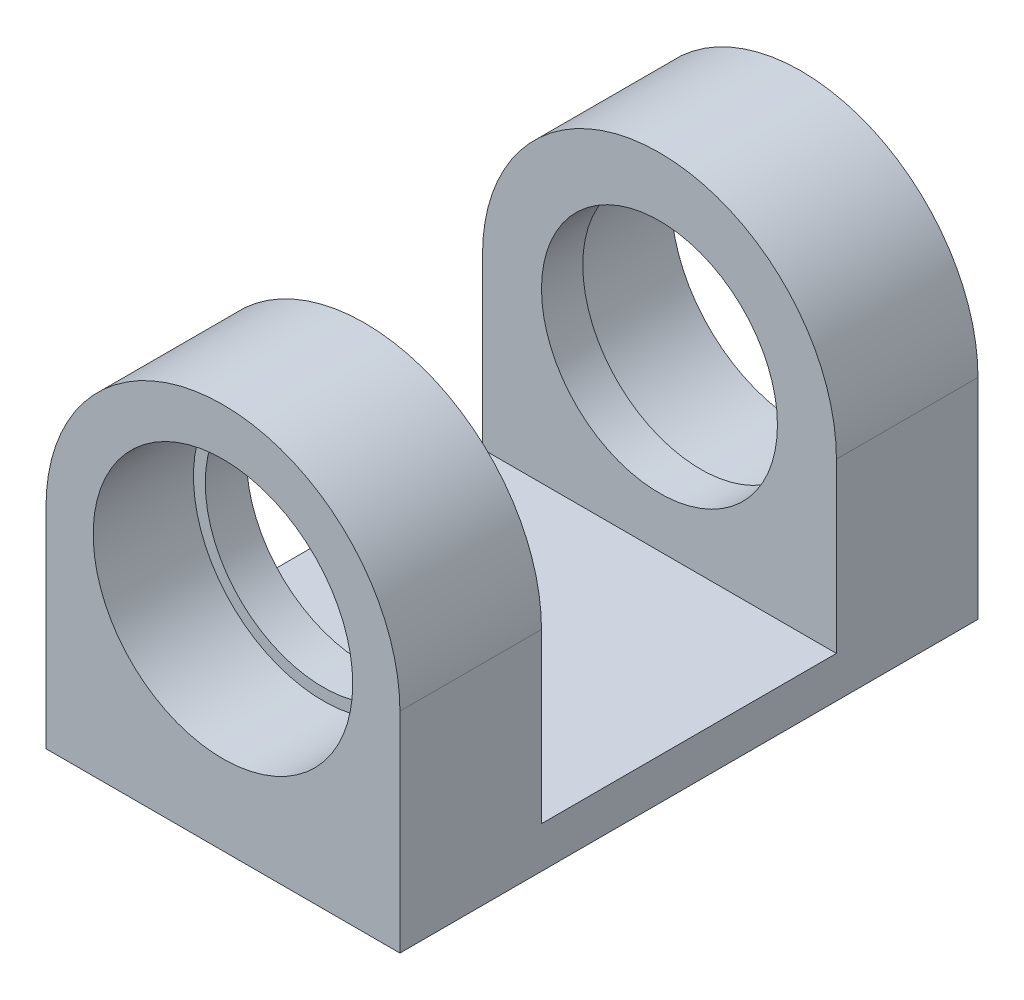
ISO-10303-21;
HEADER;
FILE_DESCRIPTION(('STEP AP214'),'2;1');
FILE_NAME('part.step','',(''),(''),'','','');
FILE_SCHEMA(('AUTOMOTIVE_DESIGN { 1 0 10303 214 1 1 1 1 }'));
ENDSEC;
DATA;
#1=APPLICATION_CONTEXT('core data for automotive mechanical design processes');
#2=APPLICATION_PROTOCOL_DEFINITION('international standard','automotive_design',2000,#1);
#3=PRODUCT_CONTEXT('',#1,'mechanical');
#4=PRODUCT('Part','Part','',(#3));
#5=PRODUCT_RELATED_PRODUCT_CATEGORY('part','',(#4));
#6=PRODUCT_DEFINITION_FORMATION('','',#4);
#7=PRODUCT_DEFINITION_CONTEXT('part definition',#1,'design');
#8=PRODUCT_DEFINITION('design','',#6,#7);
#9=PRODUCT_DEFINITION_SHAPE('','',#8);
#10=(LENGTH_UNIT() NAMED_UNIT(*) SI_UNIT(.MILLI.,.METRE.));
#11=(NAMED_UNIT(*) PLANE_ANGLE_UNIT() SI_UNIT($,.RADIAN.));
#12=(NAMED_UNIT(*) SI_UNIT($,.STERADIAN.) SOLID_ANGLE_UNIT());
#13=UNCERTAINTY_MEASURE_WITH_UNIT(LENGTH_MEASURE(1.E-05),#10,'distance_accuracy_value','');
#14=(GEOMETRIC_REPRESENTATION_CONTEXT(3) GLOBAL_UNCERTAINTY_ASSIGNED_CONTEXT((#13)) GLOBAL_UNIT_ASSIGNED_CONTEXT((#10,
#11,#12)) REPRESENTATION_CONTEXT('',''));
#15=CARTESIAN_POINT('',(0.,0.,0.));
#16=DIRECTION('',(0.,0.,1.));
#17=DIRECTION('',(1.,0.,0.));
#18=AXIS2_PLACEMENT_3D('',#15,#16,#17);
#19=CARTESIAN_POINT('',(-15.,17.76,-6.));
#20=DIRECTION('',(0.,0.,1.));
#21=DIRECTION('',(1.,0.,0.));
#22=AXIS2_PLACEMENT_3D('',#19,#20,#21);
#23=PLANE('',#22);
#24=CARTESIAN_POINT('',(-15.,17.76,-6.));
#25=DIRECTION('',(0.,0.,1.));
#26=DIRECTION('',(1.,0.,0.));
#27=AXIS2_PLACEMENT_3D('',#24,#25,#26);
#28=CIRCLE('',#27,10.);
#29=CARTESIAN_POINT('',(-5.,17.76,-6.));
#30=VERTEX_POINT('',#29);
#31=EDGE_CURVE('E188',#30,#30,#28,.T.);
#32=ORIENTED_EDGE('',*,*,#31,.T.);
#33=EDGE_LOOP('',(#32));
#34=FACE_BOUND('',#33,.T.);
#35=DIRECTION('',(1.,0.,0.));
#36=VECTOR('',#35,1.);
#37=CARTESIAN_POINT('',(0.,3.5,-6.));
#38=LINE('',#37,#36);
#39=CARTESIAN_POINT('',(-30.,3.5,-6.));
#40=VERTEX_POINT('',#39);
#41=CARTESIAN_POINT('',(0.,3.5,-6.));
#42=VERTEX_POINT('',#41);
#43=EDGE_CURVE('E62',#40,#42,#38,.T.);
#44=ORIENTED_EDGE('',*,*,#43,.F.);
#45=DIRECTION('',(0.,-1.,0.));
#46=VECTOR('',#45,1.);
#47=CARTESIAN_POINT('',(-30.,0.,-6.));
#48=LINE('',#47,#46);
#49=CARTESIAN_POINT('',(-30.,17.76,-6.));
#50=VERTEX_POINT('',#49);
#51=EDGE_CURVE('E204',#50,#40,#48,.T.);
#52=ORIENTED_EDGE('',*,*,#51,.F.);
#53=CARTESIAN_POINT('',(-15.,17.76,-6.));
#54=DIRECTION('',(0.,0.,1.));
#55=DIRECTION('',(1.,0.,0.));
#56=AXIS2_PLACEMENT_3D('',#53,#54,#55);
#57=CIRCLE('',#56,15.);
#58=CARTESIAN_POINT('',(0.,17.76,-6.));
#59=VERTEX_POINT('',#58);
#60=EDGE_CURVE('E88',#59,#50,#57,.T.);
#61=ORIENTED_EDGE('',*,*,#60,.F.);
#62=DIRECTION('',(0.,1.,0.));
#63=VECTOR('',#62,1.);
#64=CARTESIAN_POINT('',(0.,0.,-6.));
#65=LINE('',#64,#63);
#66=EDGE_CURVE('E196',#42,#59,#65,.T.);
#67=ORIENTED_EDGE('',*,*,#66,.F.);
#68=EDGE_LOOP('',(#44,#52,#61,#67));
#69=FACE_BOUND('',#68,.T.);
#70=ADVANCED_FACE('F44',(#34,#69),#23,.F.);
#71=CARTESIAN_POINT('',(0.,0.,6.));
#72=DIRECTION('',(-1.,0.,0.));
#73=DIRECTION('',(0.,0.,1.));
#74=AXIS2_PLACEMENT_3D('',#71,#72,#73);
#75=PLANE('',#74);
#76=DIRECTION('',(0.,0.,-1.));
#77=VECTOR('',#76,1.);
#78=CARTESIAN_POINT('',(0.,0.,6.));
#79=LINE('',#78,#77);
#80=CARTESIAN_POINT('',(0.,0.,6.));
#81=VERTEX_POINT('',#80);
#82=CARTESIAN_POINT('',(0.,0.,-43.));
#83=VERTEX_POINT('',#82);
#84=EDGE_CURVE('E120',#81,#83,#79,.T.);
#85=ORIENTED_EDGE('',*,*,#84,.T.);
#86=DIRECTION('',(0.,1.,0.));
#87=VECTOR('',#86,1.);
#88=CARTESIAN_POINT('',(0.,0.,-43.));
#89=LINE('',#88,#87);
#90=CARTESIAN_POINT('',(0.,17.76,-43.));
#91=VERTEX_POINT('',#90);
#92=EDGE_CURVE('E123',#83,#91,#89,.T.);
#93=ORIENTED_EDGE('',*,*,#92,.T.);
#94=DIRECTION('',(0.,0.,1.));
#95=VECTOR('',#94,1.);
#96=CARTESIAN_POINT('',(0.,17.76,-43.));
#97=LINE('',#96,#95);
#98=CARTESIAN_POINT('',(0.,17.76,-31.));
#99=VERTEX_POINT('',#98);
#100=EDGE_CURVE('E152',#91,#99,#97,.T.);
#101=ORIENTED_EDGE('',*,*,#100,.T.);
#102=DIRECTION('',(0.,1.,0.));
#103=VECTOR('',#102,1.);
#104=CARTESIAN_POINT('',(0.,0.,-31.));
#105=LINE('',#104,#103);
#106=CARTESIAN_POINT('',(0.,3.5,-31.));
#107=VERTEX_POINT('',#106);
#108=EDGE_CURVE('E154',#107,#99,#105,.T.);
#109=ORIENTED_EDGE('',*,*,#108,.F.);
#110=DIRECTION('',(0.,0.,1.));
#111=VECTOR('',#110,1.);
#112=CARTESIAN_POINT('',(0.,3.5,-31.));
#113=LINE('',#112,#111);
#114=EDGE_CURVE('E175',#107,#42,#113,.T.);
#115=ORIENTED_EDGE('',*,*,#114,.T.);
#116=ORIENTED_EDGE('',*,*,#66,.T.);
#117=DIRECTION('',(0.,0.,-1.));
#118=VECTOR('',#117,1.);
#119=CARTESIAN_POINT('',(0.,17.76,6.));
#120=LINE('',#119,#118);
#121=CARTESIAN_POINT('',(0.,17.76,6.));
#122=VERTEX_POINT('',#121);
#123=EDGE_CURVE('E11',#122,#59,#120,.T.);
#124=ORIENTED_EDGE('',*,*,#123,.F.);
#125=DIRECTION('',(0.,1.,0.));
#126=VECTOR('',#125,1.);
#127=CARTESIAN_POINT('',(0.,0.,6.));
#128=LINE('',#127,#126);
#129=EDGE_CURVE('E127',#81,#122,#128,.T.);
#130=ORIENTED_EDGE('',*,*,#129,.F.);
#131=EDGE_LOOP('',(#85,#93,#101,#109,#115,#116,#124,#130));
#132=FACE_BOUND('',#131,.T.);
#133=ADVANCED_FACE('F50',(#132),#75,.F.);
#134=CARTESIAN_POINT('',(-15.,17.76,6.));
#135=DIRECTION('',(0.,0.,-1.));
#136=DIRECTION('',(-1.,0.,0.));
#137=AXIS2_PLACEMENT_3D('',#134,#135,#136);
#138=CYLINDRICAL_SURFACE('',#137,15.);
#139=ORIENTED_EDGE('',*,*,#60,.T.);
#140=DIRECTION('',(0.,0.,-1.));
#141=VECTOR('',#140,1.);
#142=CARTESIAN_POINT('',(-30.,17.76,6.));
#143=LINE('',#142,#141);
#144=CARTESIAN_POINT('',(-30.,17.76,6.));
#145=VERTEX_POINT('',#144);
#146=EDGE_CURVE('E54',#145,#50,#143,.T.);
#147=ORIENTED_EDGE('',*,*,#146,.F.);
#148=CARTESIAN_POINT('',(-15.,17.76,6.));
#149=DIRECTION('',(0.,0.,1.));
#150=DIRECTION('',(1.,0.,0.));
#151=AXIS2_PLACEMENT_3D('',#148,#149,#150);
#152=CIRCLE('',#151,15.);
#153=EDGE_CURVE('E93',#122,#145,#152,.T.);
#154=ORIENTED_EDGE('',*,*,#153,.F.);
#155=ORIENTED_EDGE('',*,*,#123,.T.);
#156=EDGE_LOOP('',(#139,#147,#154,#155));
#157=FACE_BOUND('',#156,.T.);
#158=ADVANCED_FACE('F221',(#157),#138,.T.);
#159=CARTESIAN_POINT('',(-30.,0.,6.));
#160=DIRECTION('',(1.,0.,0.));
#161=DIRECTION('',(0.,0.,-1.));
#162=AXIS2_PLACEMENT_3D('',#159,#160,#161);
#163=PLANE('',#162);
#164=ORIENTED_EDGE('',*,*,#51,.T.);
#165=DIRECTION('',(0.,0.,1.));
#166=VECTOR('',#165,1.);
#167=CARTESIAN_POINT('',(-30.,3.5,-31.));
#168=LINE('',#167,#166);
#169=CARTESIAN_POINT('',(-30.,3.5,-31.));
#170=VERTEX_POINT('',#169);
#171=EDGE_CURVE('E182',#170,#40,#168,.T.);
#172=ORIENTED_EDGE('',*,*,#171,.F.);
#173=DIRECTION('',(0.,-1.,0.));
#174=VECTOR('',#173,1.);
#175=CARTESIAN_POINT('',(-30.,0.,-31.));
#176=LINE('',#175,#174);
#177=CARTESIAN_POINT('',(-30.,17.76,-31.));
#178=VERTEX_POINT('',#177);
#179=EDGE_CURVE('E158',#178,#170,#176,.T.);
#180=ORIENTED_EDGE('',*,*,#179,.F.);
#181=DIRECTION('',(0.,0.,1.));
#182=VECTOR('',#181,1.);
#183=CARTESIAN_POINT('',(-30.,17.76,-43.));
#184=LINE('',#183,#182);
#185=CARTESIAN_POINT('',(-30.,17.76,-43.));
#186=VERTEX_POINT('',#185);
#187=EDGE_CURVE('E169',#186,#178,#184,.T.);
#188=ORIENTED_EDGE('',*,*,#187,.F.);
#189=DIRECTION('',(0.,-1.,0.));
#190=VECTOR('',#189,1.);
#191=CARTESIAN_POINT('',(-30.,0.,-43.));
#192=LINE('',#191,#190);
#193=CARTESIAN_POINT('',(-30.,0.,-43.));
#194=VERTEX_POINT('',#193);
#195=EDGE_CURVE('E148',#186,#194,#192,.T.);
#196=ORIENTED_EDGE('',*,*,#195,.T.);
#197=DIRECTION('',(0.,0.,-1.));
#198=VECTOR('',#197,1.);
#199=CARTESIAN_POINT('',(-30.,0.,6.));
#200=LINE('',#199,#198);
#201=CARTESIAN_POINT('',(-30.,0.,6.));
#202=VERTEX_POINT('',#201);
#203=EDGE_CURVE('E128',#202,#194,#200,.T.);
#204=ORIENTED_EDGE('',*,*,#203,.F.);
#205=DIRECTION('',(0.,-1.,0.));
#206=VECTOR('',#205,1.);
#207=CARTESIAN_POINT('',(-30.,0.,6.));
#208=LINE('',#207,#206);
#209=EDGE_CURVE('E210',#145,#202,#208,.T.);
#210=ORIENTED_EDGE('',*,*,#209,.F.);
#211=ORIENTED_EDGE('',*,*,#146,.T.);
#212=EDGE_LOOP('',(#164,#172,#180,#188,#196,#204,#210,#211));
#213=FACE_BOUND('',#212,.T.);
#214=ADVANCED_FACE('F224',(#213),#163,.F.);
#215=CARTESIAN_POINT('',(0.,0.,6.));
#216=DIRECTION('',(0.,1.,0.));
#217=DIRECTION('',(0.,0.,1.));
#218=AXIS2_PLACEMENT_3D('',#215,#216,#217);
#219=PLANE('',#218);
#220=ORIENTED_EDGE('',*,*,#203,.T.);
#221=DIRECTION('',(1.,0.,0.));
#222=VECTOR('',#221,1.);
#223=CARTESIAN_POINT('',(0.,0.,-43.));
#224=LINE('',#223,#222);
#225=EDGE_CURVE('E137',#194,#83,#224,.T.);
#226=ORIENTED_EDGE('',*,*,#225,.T.);
#227=ORIENTED_EDGE('',*,*,#84,.F.);
#228=DIRECTION('',(1.,0.,0.));
#229=VECTOR('',#228,1.);
#230=CARTESIAN_POINT('',(0.,0.,6.));
#231=LINE('',#230,#229);
#232=EDGE_CURVE('E72',#202,#81,#231,.T.);
#233=ORIENTED_EDGE('',*,*,#232,.F.);
#234=EDGE_LOOP('',(#220,#226,#227,#233));
#235=FACE_BOUND('',#234,.T.);
#236=ADVANCED_FACE('F141',(#235),#219,.F.);
#237=CARTESIAN_POINT('',(-15.,17.76,6.));
#238=DIRECTION('',(0.,0.,1.));
#239=DIRECTION('',(1.,0.,0.));
#240=AXIS2_PLACEMENT_3D('',#237,#238,#239);
#241=PLANE('',#240);
#242=CARTESIAN_POINT('',(-15.,17.76,6.));
#243=DIRECTION('',(0.,0.,1.));
#244=DIRECTION('',(1.,0.,0.));
#245=AXIS2_PLACEMENT_3D('',#242,#243,#244);
#246=CIRCLE('',#245,11.);
#247=CARTESIAN_POINT('',(-4.,17.76,6.));
#248=VERTEX_POINT('',#247);
#249=EDGE_CURVE('E193',#248,#248,#246,.T.);
#250=ORIENTED_EDGE('',*,*,#249,.F.);
#251=EDGE_LOOP('',(#250));
#252=FACE_BOUND('',#251,.T.);
#253=ORIENTED_EDGE('',*,*,#129,.T.);
#254=ORIENTED_EDGE('',*,*,#153,.T.);
#255=ORIENTED_EDGE('',*,*,#209,.T.);
#256=ORIENTED_EDGE('',*,*,#232,.T.);
#257=EDGE_LOOP('',(#253,#254,#255,#256));
#258=FACE_BOUND('',#257,.T.);
#259=ADVANCED_FACE('F258',(#252,#258),#241,.T.);
#260=CARTESIAN_POINT('',(-15.,17.76,-2.5));
#261=DIRECTION('',(0.,0.,1.));
#262=DIRECTION('',(1.,0.,0.));
#263=AXIS2_PLACEMENT_3D('',#260,#261,#262);
#264=PLANE('',#263);
#265=CARTESIAN_POINT('',(-15.,17.76,-2.5));
#266=DIRECTION('',(0.,0.,1.));
#267=DIRECTION('',(1.,0.,0.));
#268=AXIS2_PLACEMENT_3D('',#265,#266,#267);
#269=CIRCLE('',#268,10.);
#270=CARTESIAN_POINT('',(-5.,17.76,-2.5));
#271=VERTEX_POINT('',#270);
#272=EDGE_CURVE('E183',#271,#271,#269,.T.);
#273=ORIENTED_EDGE('',*,*,#272,.F.);
#274=EDGE_LOOP('',(#273));
#275=FACE_BOUND('',#274,.T.);
#276=CARTESIAN_POINT('',(-15.,17.76,-2.5));
#277=DIRECTION('',(0.,0.,1.));
#278=DIRECTION('',(1.,0.,0.));
#279=AXIS2_PLACEMENT_3D('',#276,#277,#278);
#280=CIRCLE('',#279,11.);
#281=CARTESIAN_POINT('',(-4.,17.76,-2.5));
#282=VERTEX_POINT('',#281);
#283=EDGE_CURVE('E194',#282,#282,#280,.T.);
#284=ORIENTED_EDGE('',*,*,#283,.T.);
#285=EDGE_LOOP('',(#284));
#286=FACE_BOUND('',#285,.T.);
#287=ADVANCED_FACE('F272',(#275,#286),#264,.T.);
#288=CARTESIAN_POINT('',(-15.,17.76,-2.5));
#289=DIRECTION('',(0.,0.,1.));
#290=DIRECTION('',(1.,0.,0.));
#291=AXIS2_PLACEMENT_3D('',#288,#289,#290);
#292=CYLINDRICAL_SURFACE('',#291,11.);
#293=ORIENTED_EDGE('',*,*,#283,.F.);
#294=EDGE_LOOP('',(#293));
#295=FACE_BOUND('',#294,.T.);
#296=ORIENTED_EDGE('',*,*,#249,.T.);
#297=EDGE_LOOP('',(#296));
#298=FACE_BOUND('',#297,.T.);
#299=ADVANCED_FACE('F278',(#295,#298),#292,.F.);
#300=CARTESIAN_POINT('',(-15.,17.76,-11.));
#301=DIRECTION('',(0.,0.,1.));
#302=DIRECTION('',(1.,0.,0.));
#303=AXIS2_PLACEMENT_3D('',#300,#301,#302);
#304=CYLINDRICAL_SURFACE('',#303,10.);
#305=ORIENTED_EDGE('',*,*,#272,.T.);
#306=EDGE_LOOP('',(#305));
#307=FACE_BOUND('',#306,.T.);
#308=ORIENTED_EDGE('',*,*,#31,.F.);
#309=EDGE_LOOP('',(#308));
#310=FACE_BOUND('',#309,.T.);
#311=ADVANCED_FACE('F283',(#307,#310),#304,.F.);
#312=CARTESIAN_POINT('',(0.,3.5,-31.));
#313=DIRECTION('',(0.,-1.,0.));
#314=DIRECTION('',(1.,0.,0.));
#315=AXIS2_PLACEMENT_3D('',#312,#313,#314);
#316=PLANE('',#315);
#317=ORIENTED_EDGE('',*,*,#43,.T.);
#318=ORIENTED_EDGE('',*,*,#114,.F.);
#319=DIRECTION('',(1.,0.,0.));
#320=VECTOR('',#319,1.);
#321=CARTESIAN_POINT('',(0.,3.5,-31.));
#322=LINE('',#321,#320);
#323=EDGE_CURVE('E171',#170,#107,#322,.T.);
#324=ORIENTED_EDGE('',*,*,#323,.F.);
#325=ORIENTED_EDGE('',*,*,#171,.T.);
#326=EDGE_LOOP('',(#317,#318,#324,#325));
#327=FACE_BOUND('',#326,.T.);
#328=ADVANCED_FACE('F229',(#327),#316,.F.);
#329=CARTESIAN_POINT('',(-15.,17.76,-31.));
#330=DIRECTION('',(0.,0.,-1.));
#331=DIRECTION('',(1.,0.,0.));
#332=AXIS2_PLACEMENT_3D('',#329,#330,#331);
#333=PLANE('',#332);
#334=CARTESIAN_POINT('',(-15.,17.76,-31.));
#335=DIRECTION('',(0.,0.,-1.));
#336=DIRECTION('',(-1.,0.,0.));
#337=AXIS2_PLACEMENT_3D('',#334,#335,#336);
#338=CIRCLE('',#337,10.);
#339=CARTESIAN_POINT('',(-25.,17.76,-31.));
#340=VERTEX_POINT('',#339);
#341=EDGE_CURVE('E47',#340,#340,#338,.F.);
#342=ORIENTED_EDGE('',*,*,#341,.F.);
#343=EDGE_LOOP('',(#342));
#344=FACE_BOUND('',#343,.T.);
#345=ORIENTED_EDGE('',*,*,#179,.T.);
#346=ORIENTED_EDGE('',*,*,#323,.T.);
#347=ORIENTED_EDGE('',*,*,#108,.T.);
#348=CARTESIAN_POINT('',(-15.,17.76,-31.));
#349=DIRECTION('',(0.,0.,1.));
#350=DIRECTION('',(1.,0.,0.));
#351=AXIS2_PLACEMENT_3D('',#348,#349,#350);
#352=CIRCLE('',#351,15.);
#353=EDGE_CURVE('E143',#99,#178,#352,.T.);
#354=ORIENTED_EDGE('',*,*,#353,.T.);
#355=EDGE_LOOP('',(#345,#346,#347,#354));
#356=FACE_BOUND('',#355,.T.);
#357=ADVANCED_FACE('F230',(#344,#356),#333,.F.);
#358=CARTESIAN_POINT('',(-15.,17.76,-43.));
#359=DIRECTION('',(0.,0.,1.));
#360=DIRECTION('',(1.,0.,0.));
#361=AXIS2_PLACEMENT_3D('',#358,#359,#360);
#362=CYLINDRICAL_SURFACE('',#361,15.);
#363=ORIENTED_EDGE('',*,*,#353,.F.);
#364=ORIENTED_EDGE('',*,*,#100,.F.);
#365=CARTESIAN_POINT('',(-15.,17.76,-43.));
#366=DIRECTION('',(0.,0.,1.));
#367=DIRECTION('',(1.,0.,0.));
#368=AXIS2_PLACEMENT_3D('',#365,#366,#367);
#369=CIRCLE('',#368,15.);
#370=EDGE_CURVE('E139',#91,#186,#369,.T.);
#371=ORIENTED_EDGE('',*,*,#370,.T.);
#372=ORIENTED_EDGE('',*,*,#187,.T.);
#373=EDGE_LOOP('',(#363,#364,#371,#372));
#374=FACE_BOUND('',#373,.T.);
#375=ADVANCED_FACE('F234',(#374),#362,.T.);
#376=CARTESIAN_POINT('',(-15.,17.76,-43.));
#377=DIRECTION('',(0.,0.,-1.));
#378=DIRECTION('',(1.,0.,0.));
#379=AXIS2_PLACEMENT_3D('',#376,#377,#378);
#380=PLANE('',#379);
#381=CARTESIAN_POINT('',(-15.,17.76,-43.));
#382=DIRECTION('',(0.,0.,1.));
#383=DIRECTION('',(1.,0.,0.));
#384=AXIS2_PLACEMENT_3D('',#381,#382,#383);
#385=CIRCLE('',#384,11.);
#386=CARTESIAN_POINT('',(-4.,17.76,-43.));
#387=VERTEX_POINT('',#386);
#388=EDGE_CURVE('E393',#387,#387,#385,.T.);
#389=ORIENTED_EDGE('',*,*,#388,.T.);
#390=EDGE_LOOP('',(#389));
#391=FACE_BOUND('',#390,.T.);
#392=ORIENTED_EDGE('',*,*,#92,.F.);
#393=ORIENTED_EDGE('',*,*,#225,.F.);
#394=ORIENTED_EDGE('',*,*,#195,.F.);
#395=ORIENTED_EDGE('',*,*,#370,.F.);
#396=EDGE_LOOP('',(#392,#393,#394,#395));
#397=FACE_BOUND('',#396,.T.);
#398=ADVANCED_FACE('F133',(#391,#397),#380,.T.);
#399=CARTESIAN_POINT('',(-15.,17.76,-34.5));
#400=DIRECTION('',(0.,0.,-1.));
#401=DIRECTION('',(-1.,0.,0.));
#402=AXIS2_PLACEMENT_3D('',#399,#400,#401);
#403=CYLINDRICAL_SURFACE('',#402,11.);
#404=CARTESIAN_POINT('',(-15.,17.76,-34.5));
#405=DIRECTION('',(0.,0.,1.));
#406=DIRECTION('',(1.,0.,0.));
#407=AXIS2_PLACEMENT_3D('',#404,#405,#406);
#408=CIRCLE('',#407,11.);
#409=CARTESIAN_POINT('',(-4.,17.76,-34.5));
#410=VERTEX_POINT('',#409);
#411=EDGE_CURVE('E157',#410,#410,#408,.T.);
#412=ORIENTED_EDGE('',*,*,#411,.T.);
#413=EDGE_LOOP('',(#412));
#414=FACE_BOUND('',#413,.T.);
#415=ORIENTED_EDGE('',*,*,#388,.F.);
#416=EDGE_LOOP('',(#415));
#417=FACE_BOUND('',#416,.T.);
#418=ADVANCED_FACE('F241',(#414,#417),#403,.F.);
#419=CARTESIAN_POINT('',(-15.,17.76,-34.5));
#420=DIRECTION('',(0.,0.,-1.));
#421=DIRECTION('',(1.,0.,0.));
#422=AXIS2_PLACEMENT_3D('',#419,#420,#421);
#423=PLANE('',#422);
#424=CARTESIAN_POINT('',(-15.,17.76,-34.5));
#425=DIRECTION('',(0.,0.,1.));
#426=DIRECTION('',(1.,0.,0.));
#427=AXIS2_PLACEMENT_3D('',#424,#425,#426);
#428=CIRCLE('',#427,10.);
#429=CARTESIAN_POINT('',(-5.,17.76,-34.5));
#430=VERTEX_POINT('',#429);
#431=EDGE_CURVE('E388',#430,#430,#428,.T.);
#432=ORIENTED_EDGE('',*,*,#431,.T.);
#433=EDGE_LOOP('',(#432));
#434=FACE_BOUND('',#433,.T.);
#435=ORIENTED_EDGE('',*,*,#411,.F.);
#436=EDGE_LOOP('',(#435));
#437=FACE_BOUND('',#436,.T.);
#438=ADVANCED_FACE('F365',(#434,#437),#423,.T.);
#439=CARTESIAN_POINT('',(-15.,17.76,-26.));
#440=DIRECTION('',(0.,0.,-1.));
#441=DIRECTION('',(-1.,0.,0.));
#442=AXIS2_PLACEMENT_3D('',#439,#440,#441);
#443=CYLINDRICAL_SURFACE('',#442,10.);
#444=ORIENTED_EDGE('',*,*,#431,.F.);
#445=EDGE_LOOP('',(#444));
#446=FACE_BOUND('',#445,.T.);
#447=ORIENTED_EDGE('',*,*,#341,.T.);
#448=EDGE_LOOP('',(#447));
#449=FACE_BOUND('',#448,.T.);
#450=ADVANCED_FACE('F372',(#446,#449),#443,.F.);
#451=CLOSED_SHELL('',(#70,#133,#158,#214,#236,#259,#287,#299,#311,#328,#357,#375,#398,#418,#438,#450));
#452=MANIFOLD_SOLID_BREP('B2',#451);
#453=ADVANCED_BREP_SHAPE_REPRESENTATION('',(#18,#452),#14);
#454=SHAPE_DEFINITION_REPRESENTATION(#9,#453);
ENDSEC;
END-ISO-10303-21;
